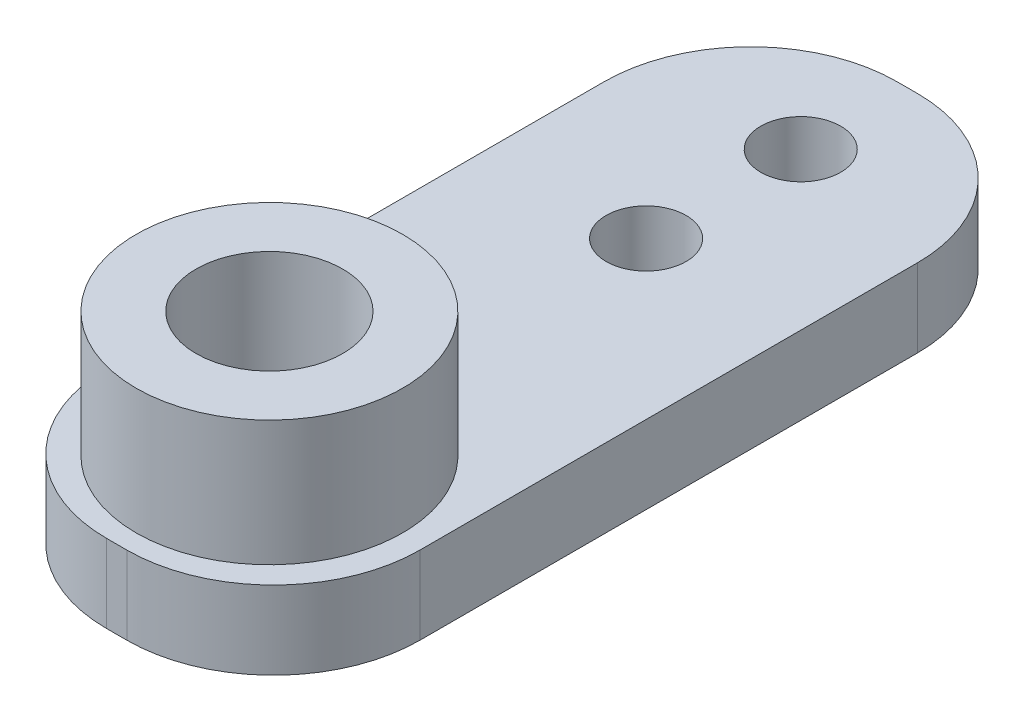
ISO-10303-21;
HEADER;
FILE_DESCRIPTION(('STEP AP214'),'2;1');
FILE_NAME('part.step','',(''),(''),'','','');
FILE_SCHEMA(('AUTOMOTIVE_DESIGN { 1 0 10303 214 1 1 1 1 }'));
ENDSEC;
DATA;
#1=APPLICATION_CONTEXT('core data for automotive mechanical design processes');
#2=APPLICATION_PROTOCOL_DEFINITION('international standard','automotive_design',2000,#1);
#3=PRODUCT_CONTEXT('',#1,'mechanical');
#4=PRODUCT('Part','Part','',(#3));
#5=PRODUCT_RELATED_PRODUCT_CATEGORY('part','',(#4));
#6=PRODUCT_DEFINITION_FORMATION('','',#4);
#7=PRODUCT_DEFINITION_CONTEXT('part definition',#1,'design');
#8=PRODUCT_DEFINITION('design','',#6,#7);
#9=PRODUCT_DEFINITION_SHAPE('','',#8);
#10=(LENGTH_UNIT() NAMED_UNIT(*) SI_UNIT(.MILLI.,.METRE.));
#11=(NAMED_UNIT(*) PLANE_ANGLE_UNIT() SI_UNIT($,.RADIAN.));
#12=(NAMED_UNIT(*) SI_UNIT($,.STERADIAN.) SOLID_ANGLE_UNIT());
#13=UNCERTAINTY_MEASURE_WITH_UNIT(LENGTH_MEASURE(1.E-05),#10,'distance_accuracy_value','');
#14=(GEOMETRIC_REPRESENTATION_CONTEXT(3) GLOBAL_UNCERTAINTY_ASSIGNED_CONTEXT((#13)) GLOBAL_UNIT_ASSIGNED_CONTEXT((#10,
#11,#12)) REPRESENTATION_CONTEXT('',''));
#15=CARTESIAN_POINT('',(0.,0.,0.));
#16=DIRECTION('',(0.,0.,1.));
#17=DIRECTION('',(1.,0.,0.));
#18=AXIS2_PLACEMENT_3D('',#15,#16,#17);
#19=CARTESIAN_POINT('',(-6.26,2.93,24.16));
#20=DIRECTION('',(0.,-1.,0.));
#21=DIRECTION('',(0.,0.,-1.));
#22=AXIS2_PLACEMENT_3D('',#19,#20,#21);
#23=CYLINDRICAL_SURFACE('',#22,5.5);
#24=CARTESIAN_POINT('',(-6.26,0.,24.16));
#25=DIRECTION('',(0.,1.,0.));
#26=DIRECTION('',(0.,0.,1.));
#27=AXIS2_PLACEMENT_3D('',#24,#25,#26);
#28=CIRCLE('',#27,5.5);
#29=CARTESIAN_POINT('',(-11.76,0.,24.16));
#30=VERTEX_POINT('',#29);
#31=CARTESIAN_POINT('',(-6.25999999999996,0.,29.66));
#32=VERTEX_POINT('',#31);
#33=EDGE_CURVE('E129',#30,#32,#28,.T.);
#34=ORIENTED_EDGE('',*,*,#33,.T.);
#35=DIRECTION('',(0.,-1.,0.));
#36=VECTOR('',#35,1.);
#37=CARTESIAN_POINT('',(-6.25999999999996,2.93,29.66));
#38=LINE('',#37,#36);
#39=CARTESIAN_POINT('',(-6.25999999999996,2.93,29.66));
#40=VERTEX_POINT('',#39);
#41=EDGE_CURVE('E11',#40,#32,#38,.T.);
#42=ORIENTED_EDGE('',*,*,#41,.F.);
#43=CARTESIAN_POINT('',(-6.26,2.93,24.16));
#44=DIRECTION('',(0.,1.,0.));
#45=DIRECTION('',(0.,0.,1.));
#46=AXIS2_PLACEMENT_3D('',#43,#44,#45);
#47=CIRCLE('',#46,5.5);
#48=CARTESIAN_POINT('',(-11.76,2.93,24.16));
#49=VERTEX_POINT('',#48);
#50=EDGE_CURVE('E144',#49,#40,#47,.T.);
#51=ORIENTED_EDGE('',*,*,#50,.F.);
#52=DIRECTION('',(0.,-1.,0.));
#53=VECTOR('',#52,1.);
#54=CARTESIAN_POINT('',(-11.76,2.93,24.16));
#55=LINE('',#54,#53);
#56=EDGE_CURVE('E125',#49,#30,#55,.T.);
#57=ORIENTED_EDGE('',*,*,#56,.T.);
#58=EDGE_LOOP('',(#34,#42,#51,#57));
#59=FACE_BOUND('',#58,.T.);
#60=ADVANCED_FACE('F33',(#59),#23,.T.);
#61=CARTESIAN_POINT('',(-5.50000000000004,2.93,29.66));
#62=DIRECTION('',(0.,0.,-1.));
#63=DIRECTION('',(-1.,0.,0.));
#64=AXIS2_PLACEMENT_3D('',#61,#62,#63);
#65=PLANE('',#64);
#66=DIRECTION('',(1.,0.,0.));
#67=VECTOR('',#66,1.);
#68=CARTESIAN_POINT('',(-5.50000000000004,0.,29.66));
#69=LINE('',#68,#67);
#70=CARTESIAN_POINT('',(-5.50000000000004,0.,29.66));
#71=VERTEX_POINT('',#70);
#72=EDGE_CURVE('E132',#32,#71,#69,.T.);
#73=ORIENTED_EDGE('',*,*,#72,.T.);
#74=DIRECTION('',(0.,-1.,0.));
#75=VECTOR('',#74,1.);
#76=CARTESIAN_POINT('',(-5.50000000000004,2.93,29.66));
#77=LINE('',#76,#75);
#78=CARTESIAN_POINT('',(-5.50000000000004,2.93,29.66));
#79=VERTEX_POINT('',#78);
#80=EDGE_CURVE('E41',#79,#71,#77,.T.);
#81=ORIENTED_EDGE('',*,*,#80,.F.);
#82=DIRECTION('',(1.,0.,0.));
#83=VECTOR('',#82,1.);
#84=CARTESIAN_POINT('',(-5.50000000000004,2.93,29.66));
#85=LINE('',#84,#83);
#86=EDGE_CURVE('E92',#40,#79,#85,.T.);
#87=ORIENTED_EDGE('',*,*,#86,.F.);
#88=ORIENTED_EDGE('',*,*,#41,.T.);
#89=EDGE_LOOP('',(#73,#81,#87,#88));
#90=FACE_BOUND('',#89,.T.);
#91=ADVANCED_FACE('F228',(#90),#65,.F.);
#92=CARTESIAN_POINT('',(-5.5,2.93,24.16));
#93=DIRECTION('',(0.,-1.,0.));
#94=DIRECTION('',(0.,0.,-1.));
#95=AXIS2_PLACEMENT_3D('',#92,#93,#94);
#96=CYLINDRICAL_SURFACE('',#95,5.5);
#97=CARTESIAN_POINT('',(-5.5,0.,24.16));
#98=DIRECTION('',(0.,1.,0.));
#99=DIRECTION('',(0.,0.,1.));
#100=AXIS2_PLACEMENT_3D('',#97,#98,#99);
#101=CIRCLE('',#100,5.5);
#102=CARTESIAN_POINT('',(0.,0.,24.16));
#103=VERTEX_POINT('',#102);
#104=EDGE_CURVE('E135',#71,#103,#101,.T.);
#105=ORIENTED_EDGE('',*,*,#104,.T.);
#106=DIRECTION('',(0.,-1.,0.));
#107=VECTOR('',#106,1.);
#108=CARTESIAN_POINT('',(0.,2.93,24.16));
#109=LINE('',#108,#107);
#110=CARTESIAN_POINT('',(0.,2.93,24.16));
#111=VERTEX_POINT('',#110);
#112=EDGE_CURVE('E151',#111,#103,#109,.T.);
#113=ORIENTED_EDGE('',*,*,#112,.F.);
#114=CARTESIAN_POINT('',(-5.5,2.93,24.16));
#115=DIRECTION('',(0.,1.,0.));
#116=DIRECTION('',(0.,0.,1.));
#117=AXIS2_PLACEMENT_3D('',#114,#115,#116);
#118=CIRCLE('',#117,5.5);
#119=EDGE_CURVE('E159',#79,#111,#118,.T.);
#120=ORIENTED_EDGE('',*,*,#119,.F.);
#121=ORIENTED_EDGE('',*,*,#80,.T.);
#122=EDGE_LOOP('',(#105,#113,#120,#121));
#123=FACE_BOUND('',#122,.T.);
#124=ADVANCED_FACE('F157',(#123),#96,.T.);
#125=CARTESIAN_POINT('',(0.,2.93,5.50000000000004));
#126=DIRECTION('',(-1.,0.,0.));
#127=DIRECTION('',(0.,0.,1.));
#128=AXIS2_PLACEMENT_3D('',#125,#126,#127);
#129=PLANE('',#128);
#130=DIRECTION('',(0.,0.,-1.));
#131=VECTOR('',#130,1.);
#132=CARTESIAN_POINT('',(0.,0.,5.50000000000004));
#133=LINE('',#132,#131);
#134=CARTESIAN_POINT('',(0.,0.,5.50000000000004));
#135=VERTEX_POINT('',#134);
#136=EDGE_CURVE('E137',#103,#135,#133,.T.);
#137=ORIENTED_EDGE('',*,*,#136,.T.);
#138=DIRECTION('',(0.,-1.,0.));
#139=VECTOR('',#138,1.);
#140=CARTESIAN_POINT('',(0.,2.93,5.50000000000004));
#141=LINE('',#140,#139);
#142=CARTESIAN_POINT('',(0.,2.93,5.50000000000004));
#143=VERTEX_POINT('',#142);
#144=EDGE_CURVE('E148',#143,#135,#141,.T.);
#145=ORIENTED_EDGE('',*,*,#144,.F.);
#146=DIRECTION('',(0.,0.,-1.));
#147=VECTOR('',#146,1.);
#148=CARTESIAN_POINT('',(0.,2.93,5.50000000000004));
#149=LINE('',#148,#147);
#150=EDGE_CURVE('E171',#111,#143,#149,.T.);
#151=ORIENTED_EDGE('',*,*,#150,.F.);
#152=ORIENTED_EDGE('',*,*,#112,.T.);
#153=EDGE_LOOP('',(#137,#145,#151,#152));
#154=FACE_BOUND('',#153,.T.);
#155=ADVANCED_FACE('F167',(#154),#129,.F.);
#156=CARTESIAN_POINT('',(-5.5,2.93,5.5));
#157=DIRECTION('',(0.,-1.,0.));
#158=DIRECTION('',(0.,0.,-1.));
#159=AXIS2_PLACEMENT_3D('',#156,#157,#158);
#160=CYLINDRICAL_SURFACE('',#159,5.5);
#161=CARTESIAN_POINT('',(-5.5,0.,5.5));
#162=DIRECTION('',(0.,1.,0.));
#163=DIRECTION('',(0.,0.,1.));
#164=AXIS2_PLACEMENT_3D('',#161,#162,#163);
#165=CIRCLE('',#164,5.5);
#166=CARTESIAN_POINT('',(-5.50000000000004,0.,0.));
#167=VERTEX_POINT('',#166);
#168=EDGE_CURVE('E139',#135,#167,#165,.T.);
#169=ORIENTED_EDGE('',*,*,#168,.T.);
#170=DIRECTION('',(0.,-1.,0.));
#171=VECTOR('',#170,1.);
#172=CARTESIAN_POINT('',(-5.50000000000004,2.93,0.));
#173=LINE('',#172,#171);
#174=CARTESIAN_POINT('',(-5.50000000000004,2.93,0.));
#175=VERTEX_POINT('',#174);
#176=EDGE_CURVE('E120',#175,#167,#173,.T.);
#177=ORIENTED_EDGE('',*,*,#176,.F.);
#178=CARTESIAN_POINT('',(-5.5,2.93,5.5));
#179=DIRECTION('',(0.,1.,0.));
#180=DIRECTION('',(0.,0.,1.));
#181=AXIS2_PLACEMENT_3D('',#178,#179,#180);
#182=CIRCLE('',#181,5.5);
#183=EDGE_CURVE('E111',#143,#175,#182,.T.);
#184=ORIENTED_EDGE('',*,*,#183,.F.);
#185=ORIENTED_EDGE('',*,*,#144,.T.);
#186=EDGE_LOOP('',(#169,#177,#184,#185));
#187=FACE_BOUND('',#186,.T.);
#188=ADVANCED_FACE('F170',(#187),#160,.T.);
#189=CARTESIAN_POINT('',(-5.50000000000004,2.93,0.));
#190=DIRECTION('',(0.,0.,1.));
#191=DIRECTION('',(1.,0.,0.));
#192=AXIS2_PLACEMENT_3D('',#189,#190,#191);
#193=PLANE('',#192);
#194=DIRECTION('',(-1.,0.,0.));
#195=VECTOR('',#194,1.);
#196=CARTESIAN_POINT('',(-5.50000000000004,0.,0.));
#197=LINE('',#196,#195);
#198=CARTESIAN_POINT('',(-6.26,0.,0.));
#199=VERTEX_POINT('',#198);
#200=EDGE_CURVE('E119',#167,#199,#197,.T.);
#201=ORIENTED_EDGE('',*,*,#200,.T.);
#202=DIRECTION('',(0.,-1.,0.));
#203=VECTOR('',#202,1.);
#204=CARTESIAN_POINT('',(-6.26,2.93,0.));
#205=LINE('',#204,#203);
#206=CARTESIAN_POINT('',(-6.26,2.93,0.));
#207=VERTEX_POINT('',#206);
#208=EDGE_CURVE('E116',#207,#199,#205,.T.);
#209=ORIENTED_EDGE('',*,*,#208,.F.);
#210=DIRECTION('',(-1.,0.,0.));
#211=VECTOR('',#210,1.);
#212=CARTESIAN_POINT('',(-5.50000000000004,2.93,0.));
#213=LINE('',#212,#211);
#214=EDGE_CURVE('E105',#175,#207,#213,.T.);
#215=ORIENTED_EDGE('',*,*,#214,.F.);
#216=ORIENTED_EDGE('',*,*,#176,.T.);
#217=EDGE_LOOP('',(#201,#209,#215,#216));
#218=FACE_BOUND('',#217,.T.);
#219=ADVANCED_FACE('F117',(#218),#193,.F.);
#220=CARTESIAN_POINT('',(-6.26,2.93,5.5));
#221=DIRECTION('',(0.,-1.,0.));
#222=DIRECTION('',(0.,0.,-1.));
#223=AXIS2_PLACEMENT_3D('',#220,#221,#222);
#224=CYLINDRICAL_SURFACE('',#223,5.5);
#225=CARTESIAN_POINT('',(-6.26,0.,5.5));
#226=DIRECTION('',(0.,1.,0.));
#227=DIRECTION('',(0.,0.,-1.));
#228=AXIS2_PLACEMENT_3D('',#225,#226,#227);
#229=CIRCLE('',#228,5.5);
#230=CARTESIAN_POINT('',(-11.76,0.,5.50000000000004));
#231=VERTEX_POINT('',#230);
#232=EDGE_CURVE('E78',#199,#231,#229,.T.);
#233=ORIENTED_EDGE('',*,*,#232,.T.);
#234=DIRECTION('',(0.,-1.,0.));
#235=VECTOR('',#234,1.);
#236=CARTESIAN_POINT('',(-11.76,2.93,5.50000000000004));
#237=LINE('',#236,#235);
#238=CARTESIAN_POINT('',(-11.76,2.93,5.50000000000004));
#239=VERTEX_POINT('',#238);
#240=EDGE_CURVE('E121',#239,#231,#237,.T.);
#241=ORIENTED_EDGE('',*,*,#240,.F.);
#242=CARTESIAN_POINT('',(-6.26,2.93,5.5));
#243=DIRECTION('',(0.,1.,0.));
#244=DIRECTION('',(0.,0.,-1.));
#245=AXIS2_PLACEMENT_3D('',#242,#243,#244);
#246=CIRCLE('',#245,5.5);
#247=EDGE_CURVE('E109',#207,#239,#246,.T.);
#248=ORIENTED_EDGE('',*,*,#247,.F.);
#249=ORIENTED_EDGE('',*,*,#208,.T.);
#250=EDGE_LOOP('',(#233,#241,#248,#249));
#251=FACE_BOUND('',#250,.T.);
#252=ADVANCED_FACE('F123',(#251),#224,.T.);
#253=CARTESIAN_POINT('',(-11.76,2.93,5.50000000000004));
#254=DIRECTION('',(1.,0.,0.));
#255=DIRECTION('',(0.,0.,-1.));
#256=AXIS2_PLACEMENT_3D('',#253,#254,#255);
#257=PLANE('',#256);
#258=DIRECTION('',(0.,0.,1.));
#259=VECTOR('',#258,1.);
#260=CARTESIAN_POINT('',(-11.76,0.,5.50000000000004));
#261=LINE('',#260,#259);
#262=EDGE_CURVE('E84',#231,#30,#261,.T.);
#263=ORIENTED_EDGE('',*,*,#262,.T.);
#264=ORIENTED_EDGE('',*,*,#56,.F.);
#265=DIRECTION('',(0.,0.,1.));
#266=VECTOR('',#265,1.);
#267=CARTESIAN_POINT('',(-11.76,2.93,5.50000000000004));
#268=LINE('',#267,#266);
#269=EDGE_CURVE('E49',#239,#49,#268,.T.);
#270=ORIENTED_EDGE('',*,*,#269,.F.);
#271=ORIENTED_EDGE('',*,*,#240,.T.);
#272=EDGE_LOOP('',(#263,#264,#270,#271));
#273=FACE_BOUND('',#272,.T.);
#274=ADVANCED_FACE('F206',(#273),#257,.F.);
#275=CARTESIAN_POINT('',(-6.26,2.93,24.16));
#276=DIRECTION('',(0.,1.,0.));
#277=DIRECTION('',(0.,0.,1.));
#278=AXIS2_PLACEMENT_3D('',#275,#276,#277);
#279=PLANE('',#278);
#280=CARTESIAN_POINT('',(-5.88000000000002,2.93,9.8));
#281=DIRECTION('',(0.,1.,0.));
#282=DIRECTION('',(0.,0.,1.));
#283=AXIS2_PLACEMENT_3D('',#280,#281,#282);
#284=CIRCLE('',#283,1.5);
#285=CARTESIAN_POINT('',(-5.88000000000002,2.93,11.3));
#286=VERTEX_POINT('',#285);
#287=EDGE_CURVE('E197',#286,#286,#284,.T.);
#288=ORIENTED_EDGE('',*,*,#287,.F.);
#289=EDGE_LOOP('',(#288));
#290=FACE_BOUND('',#289,.T.);
#291=CARTESIAN_POINT('',(-5.88000000000002,2.93,4.));
#292=DIRECTION('',(0.,1.,0.));
#293=DIRECTION('',(0.,0.,1.));
#294=AXIS2_PLACEMENT_3D('',#291,#292,#293);
#295=CIRCLE('',#294,1.5);
#296=CARTESIAN_POINT('',(-5.88000000000002,2.93,5.5));
#297=VERTEX_POINT('',#296);
#298=EDGE_CURVE('E191',#297,#297,#295,.T.);
#299=ORIENTED_EDGE('',*,*,#298,.F.);
#300=EDGE_LOOP('',(#299));
#301=FACE_BOUND('',#300,.T.);
#302=CARTESIAN_POINT('',(-5.88,2.93,23.93));
#303=DIRECTION('',(0.,1.,0.));
#304=DIRECTION('',(0.,0.,1.));
#305=AXIS2_PLACEMENT_3D('',#302,#303,#304);
#306=CIRCLE('',#305,5.);
#307=CARTESIAN_POINT('',(-5.88,2.93,28.93));
#308=VERTEX_POINT('',#307);
#309=EDGE_CURVE('E177',#308,#308,#306,.T.);
#310=ORIENTED_EDGE('',*,*,#309,.F.);
#311=EDGE_LOOP('',(#310));
#312=FACE_BOUND('',#311,.T.);
#313=ORIENTED_EDGE('',*,*,#50,.T.);
#314=ORIENTED_EDGE('',*,*,#86,.T.);
#315=ORIENTED_EDGE('',*,*,#119,.T.);
#316=ORIENTED_EDGE('',*,*,#150,.T.);
#317=ORIENTED_EDGE('',*,*,#183,.T.);
#318=ORIENTED_EDGE('',*,*,#214,.T.);
#319=ORIENTED_EDGE('',*,*,#247,.T.);
#320=ORIENTED_EDGE('',*,*,#269,.T.);
#321=EDGE_LOOP('',(#313,#314,#315,#316,#317,#318,#319,#320));
#322=FACE_BOUND('',#321,.T.);
#323=ADVANCED_FACE('F107',(#290,#301,#312,#322),#279,.T.);
#324=CARTESIAN_POINT('',(-6.26,0.,24.16));
#325=DIRECTION('',(0.,1.,0.));
#326=DIRECTION('',(0.,0.,1.));
#327=AXIS2_PLACEMENT_3D('',#324,#325,#326);
#328=PLANE('',#327);
#329=CARTESIAN_POINT('',(-5.88000000000002,0.,9.8));
#330=DIRECTION('',(0.,1.,0.));
#331=DIRECTION('',(0.,0.,1.));
#332=AXIS2_PLACEMENT_3D('',#329,#330,#331);
#333=CIRCLE('',#332,1.5);
#334=CARTESIAN_POINT('',(-5.88000000000002,0.,11.3));
#335=VERTEX_POINT('',#334);
#336=EDGE_CURVE('E194',#335,#335,#333,.F.);
#337=ORIENTED_EDGE('',*,*,#336,.F.);
#338=EDGE_LOOP('',(#337));
#339=FACE_BOUND('',#338,.T.);
#340=CARTESIAN_POINT('',(-5.88000000000002,0.,4.));
#341=DIRECTION('',(0.,1.,0.));
#342=DIRECTION('',(0.,0.,1.));
#343=AXIS2_PLACEMENT_3D('',#340,#341,#342);
#344=CIRCLE('',#343,1.5);
#345=CARTESIAN_POINT('',(-5.88000000000002,0.,5.5));
#346=VERTEX_POINT('',#345);
#347=EDGE_CURVE('E188',#346,#346,#344,.F.);
#348=ORIENTED_EDGE('',*,*,#347,.F.);
#349=EDGE_LOOP('',(#348));
#350=FACE_BOUND('',#349,.T.);
#351=CARTESIAN_POINT('',(-5.88,0.,23.93));
#352=DIRECTION('',(0.,1.,0.));
#353=DIRECTION('',(0.,0.,1.));
#354=AXIS2_PLACEMENT_3D('',#351,#352,#353);
#355=CIRCLE('',#354,2.75);
#356=CARTESIAN_POINT('',(-5.88,0.,26.68));
#357=VERTEX_POINT('',#356);
#358=EDGE_CURVE('E180',#357,#357,#355,.F.);
#359=ORIENTED_EDGE('',*,*,#358,.F.);
#360=EDGE_LOOP('',(#359));
#361=FACE_BOUND('',#360,.T.);
#362=ORIENTED_EDGE('',*,*,#33,.F.);
#363=ORIENTED_EDGE('',*,*,#262,.F.);
#364=ORIENTED_EDGE('',*,*,#232,.F.);
#365=ORIENTED_EDGE('',*,*,#200,.F.);
#366=ORIENTED_EDGE('',*,*,#168,.F.);
#367=ORIENTED_EDGE('',*,*,#136,.F.);
#368=ORIENTED_EDGE('',*,*,#104,.F.);
#369=ORIENTED_EDGE('',*,*,#72,.F.);
#370=EDGE_LOOP('',(#362,#363,#364,#365,#366,#367,#368,#369));
#371=FACE_BOUND('',#370,.T.);
#372=ADVANCED_FACE('F163',(#339,#350,#361,#371),#328,.F.);
#373=CARTESIAN_POINT('',(-5.88,7.63,23.93));
#374=DIRECTION('',(0.,-1.,0.));
#375=DIRECTION('',(0.,0.,-1.));
#376=AXIS2_PLACEMENT_3D('',#373,#374,#375);
#377=CYLINDRICAL_SURFACE('',#376,5.);
#378=CARTESIAN_POINT('',(-5.88,7.63,23.93));
#379=DIRECTION('',(0.,1.,0.));
#380=DIRECTION('',(0.,0.,1.));
#381=AXIS2_PLACEMENT_3D('',#378,#379,#380);
#382=CIRCLE('',#381,5.);
#383=CARTESIAN_POINT('',(-5.88,7.63,28.93));
#384=VERTEX_POINT('',#383);
#385=EDGE_CURVE('E133',#384,#384,#382,.T.);
#386=ORIENTED_EDGE('',*,*,#385,.F.);
#387=EDGE_LOOP('',(#386));
#388=FACE_BOUND('',#387,.T.);
#389=ORIENTED_EDGE('',*,*,#309,.T.);
#390=EDGE_LOOP('',(#389));
#391=FACE_BOUND('',#390,.T.);
#392=ADVANCED_FACE('F212',(#388,#391),#377,.T.);
#393=CARTESIAN_POINT('',(-5.88,7.63,23.93));
#394=DIRECTION('',(0.,1.,0.));
#395=DIRECTION('',(0.,0.,1.));
#396=AXIS2_PLACEMENT_3D('',#393,#394,#395);
#397=PLANE('',#396);
#398=CARTESIAN_POINT('',(-5.88,7.63,23.93));
#399=DIRECTION('',(0.,1.,0.));
#400=DIRECTION('',(0.,0.,1.));
#401=AXIS2_PLACEMENT_3D('',#398,#399,#400);
#402=CIRCLE('',#401,2.75);
#403=CARTESIAN_POINT('',(-5.88,7.63,26.68));
#404=VERTEX_POINT('',#403);
#405=EDGE_CURVE('E185',#404,#404,#402,.T.);
#406=ORIENTED_EDGE('',*,*,#405,.F.);
#407=EDGE_LOOP('',(#406));
#408=FACE_BOUND('',#407,.T.);
#409=ORIENTED_EDGE('',*,*,#385,.T.);
#410=EDGE_LOOP('',(#409));
#411=FACE_BOUND('',#410,.T.);
#412=ADVANCED_FACE('F214',(#408,#411),#397,.T.);
#413=CARTESIAN_POINT('',(-5.88,-0.00100000000000013,23.93));
#414=DIRECTION('',(0.,1.,0.));
#415=DIRECTION('',(0.,0.,1.));
#416=AXIS2_PLACEMENT_3D('',#413,#414,#415);
#417=CYLINDRICAL_SURFACE('',#416,2.75);
#418=CARTESIAN_POINT('',(-5.88,7.63,26.68));
#419=CARTESIAN_POINT('',(-5.88,7.55052083333333,26.68));
#420=CARTESIAN_POINT('',(-5.88,7.47104166666667,26.68));
#421=CARTESIAN_POINT('',(-5.88,7.31208333333333,26.68));
#422=CARTESIAN_POINT('',(-5.88,7.23260416666667,26.68));
#423=CARTESIAN_POINT('',(-5.88,7.07364583333333,26.68));
#424=CARTESIAN_POINT('',(-5.88,6.99416666666667,26.68));
#425=CARTESIAN_POINT('',(-5.88,6.83520833333333,26.68));
#426=CARTESIAN_POINT('',(-5.88,6.75572916666667,26.68));
#427=CARTESIAN_POINT('',(-5.88,6.59677083333333,26.68));
#428=CARTESIAN_POINT('',(-5.88,6.51729166666667,26.68));
#429=CARTESIAN_POINT('',(-5.88,6.35833333333333,26.68));
#430=CARTESIAN_POINT('',(-5.88,6.27885416666667,26.68));
#431=CARTESIAN_POINT('',(-5.88,6.11989583333333,26.68));
#432=CARTESIAN_POINT('',(-5.88,6.04041666666667,26.68));
#433=CARTESIAN_POINT('',(-5.88,5.88145833333333,26.68));
#434=CARTESIAN_POINT('',(-5.88,5.80197916666667,26.68));
#435=CARTESIAN_POINT('',(-5.88,5.64302083333333,26.68));
#436=CARTESIAN_POINT('',(-5.88,5.56354166666667,26.68));
#437=CARTESIAN_POINT('',(-5.88,5.40458333333333,26.68));
#438=CARTESIAN_POINT('',(-5.88,5.32510416666667,26.68));
#439=CARTESIAN_POINT('',(-5.88,5.16614583333333,26.68));
#440=CARTESIAN_POINT('',(-5.88,5.08666666666667,26.68));
#441=CARTESIAN_POINT('',(-5.88,4.92770833333333,26.68));
#442=CARTESIAN_POINT('',(-5.88,4.84822916666667,26.68));
#443=CARTESIAN_POINT('',(-5.88,4.68927083333333,26.68));
#444=CARTESIAN_POINT('',(-5.88,4.60979166666667,26.68));
#445=CARTESIAN_POINT('',(-5.88,4.45083333333333,26.68));
#446=CARTESIAN_POINT('',(-5.88,4.37135416666667,26.68));
#447=CARTESIAN_POINT('',(-5.88,4.21239583333333,26.68));
#448=CARTESIAN_POINT('',(-5.88,4.13291666666667,26.68));
#449=CARTESIAN_POINT('',(-5.88,3.97395833333333,26.68));
#450=CARTESIAN_POINT('',(-5.88,3.89447916666667,26.68));
#451=CARTESIAN_POINT('',(-5.88,3.73552083333333,26.68));
#452=CARTESIAN_POINT('',(-5.88,3.65604166666667,26.68));
#453=CARTESIAN_POINT('',(-5.88,3.49708333333333,26.68));
#454=CARTESIAN_POINT('',(-5.88,3.41760416666667,26.68));
#455=CARTESIAN_POINT('',(-5.88,3.25864583333333,26.68));
#456=CARTESIAN_POINT('',(-5.88,3.17916666666667,26.68));
#457=CARTESIAN_POINT('',(-5.88,3.02020833333333,26.68));
#458=CARTESIAN_POINT('',(-5.88,2.94072916666667,26.68));
#459=CARTESIAN_POINT('',(-5.88,2.78177083333333,26.68));
#460=CARTESIAN_POINT('',(-5.88,2.70229166666667,26.68));
#461=CARTESIAN_POINT('',(-5.88,2.54333333333333,26.68));
#462=CARTESIAN_POINT('',(-5.88,2.46385416666667,26.68));
#463=CARTESIAN_POINT('',(-5.88,2.30489583333333,26.68));
#464=CARTESIAN_POINT('',(-5.88,2.22541666666667,26.68));
#465=CARTESIAN_POINT('',(-5.88,2.06645833333333,26.68));
#466=CARTESIAN_POINT('',(-5.88,1.98697916666667,26.68));
#467=CARTESIAN_POINT('',(-5.88,1.82802083333333,26.68));
#468=CARTESIAN_POINT('',(-5.88,1.74854166666667,26.68));
#469=CARTESIAN_POINT('',(-5.88,1.58958333333333,26.68));
#470=CARTESIAN_POINT('',(-5.88,1.51010416666667,26.68));
#471=CARTESIAN_POINT('',(-5.88,1.35114583333333,26.68));
#472=CARTESIAN_POINT('',(-5.88,1.27166666666667,26.68));
#473=CARTESIAN_POINT('',(-5.88,1.11270833333333,26.68));
#474=CARTESIAN_POINT('',(-5.88,1.03322916666667,26.68));
#475=CARTESIAN_POINT('',(-5.88,0.874270833333333,26.68));
#476=CARTESIAN_POINT('',(-5.88,0.794791666666666,26.68));
#477=CARTESIAN_POINT('',(-5.88,0.635833333333333,26.68));
#478=CARTESIAN_POINT('',(-5.88,0.556354166666666,26.68));
#479=CARTESIAN_POINT('',(-5.88,0.397395833333333,26.68));
#480=CARTESIAN_POINT('',(-5.88,0.317916666666667,26.68));
#481=CARTESIAN_POINT('',(-5.88,0.158958333333333,26.68));
#482=CARTESIAN_POINT('',(-5.88,0.0794791666666665,26.68));
#483=CARTESIAN_POINT('',(-5.88,0.,26.68));
#484=B_SPLINE_CURVE_WITH_KNOTS('',3,(#418,#419,#420,#421,#422,#423,#424,#425,#426,#427,#428,
#429,#430,#431,#432,#433,#434,#435,#436,#437,#438,#439,#440,#441,#442,#443,#444,#445,#446,#447,
#448,#449,#450,#451,#452,#453,#454,#455,#456,#457,#458,#459,#460,#461,#462,#463,#464,#465,#466,
#467,#468,#469,#470,#471,#472,#473,#474,#475,#476,#477,#478,#479,#480,#481,#482,#483),
.UNSPECIFIED.,.F.,.F.,(4,2,2,2,2,2,2,2,2,2,2,2,2,2,2,2,2,2,2,2,2,2,2,2,2,2,2,2,2,2,2,2,4),(0.,
0.2384375,0.476875,0.7153125,0.95375,1.1921875,1.430625,1.6690625,1.9075,2.1459375,2.384375,
2.6228125,2.86125,3.0996875,3.338125,3.5765625,3.815,4.0534375,4.291875,4.5303125,4.76875,
5.0071875,5.245625,5.4840625,5.7225,5.9609375,6.199375,6.4378125,6.67625,6.9146875,7.153125,
7.3915625,7.63),.UNSPECIFIED.);
#485=EDGE_CURVE('BSEAM221',#404,#357,#484,.T.);
#486=ORIENTED_EDGE('',*,*,#405,.T.);
#487=ORIENTED_EDGE('',*,*,#358,.T.);
#488=ORIENTED_EDGE('',*,*,#485,.T.);
#489=ORIENTED_EDGE('',*,*,#485,.F.);
#490=EDGE_LOOP('',(#486,#488,#487,#489));
#491=FACE_BOUND('',#490,.T.);
#492=ADVANCED_FACE('F221',(#491),#417,.F.);
#493=CARTESIAN_POINT('',(-5.88000000000002,-0.00100000000000013,4.));
#494=DIRECTION('',(0.,1.,0.));
#495=DIRECTION('',(0.,0.,1.));
#496=AXIS2_PLACEMENT_3D('',#493,#494,#495);
#497=CYLINDRICAL_SURFACE('',#496,1.5);
#498=ORIENTED_EDGE('',*,*,#298,.T.);
#499=EDGE_LOOP('',(#498));
#500=FACE_BOUND('',#499,.T.);
#501=ORIENTED_EDGE('',*,*,#347,.T.);
#502=EDGE_LOOP('',(#501));
#503=FACE_BOUND('',#502,.T.);
#504=ADVANCED_FACE('F294',(#500,#503),#497,.F.);
#505=CARTESIAN_POINT('',(-5.88000000000002,-0.00100000000000013,9.8));
#506=DIRECTION('',(0.,1.,0.));
#507=DIRECTION('',(0.,0.,1.));
#508=AXIS2_PLACEMENT_3D('',#505,#506,#507);
#509=CYLINDRICAL_SURFACE('',#508,1.5);
#510=ORIENTED_EDGE('',*,*,#287,.T.);
#511=EDGE_LOOP('',(#510));
#512=FACE_BOUND('',#511,.T.);
#513=ORIENTED_EDGE('',*,*,#336,.T.);
#514=EDGE_LOOP('',(#513));
#515=FACE_BOUND('',#514,.T.);
#516=ADVANCED_FACE('F201',(#512,#515),#509,.F.);
#517=CLOSED_SHELL('',(#60,#91,#124,#155,#188,#219,#252,#274,#323,#372,#392,#412,#492,#504,#516));
#518=MANIFOLD_SOLID_BREP('B2',#517);
#519=ADVANCED_BREP_SHAPE_REPRESENTATION('',(#18,#518),#14);
#520=SHAPE_DEFINITION_REPRESENTATION(#9,#519);
ENDSEC;
END-ISO-10303-21;
